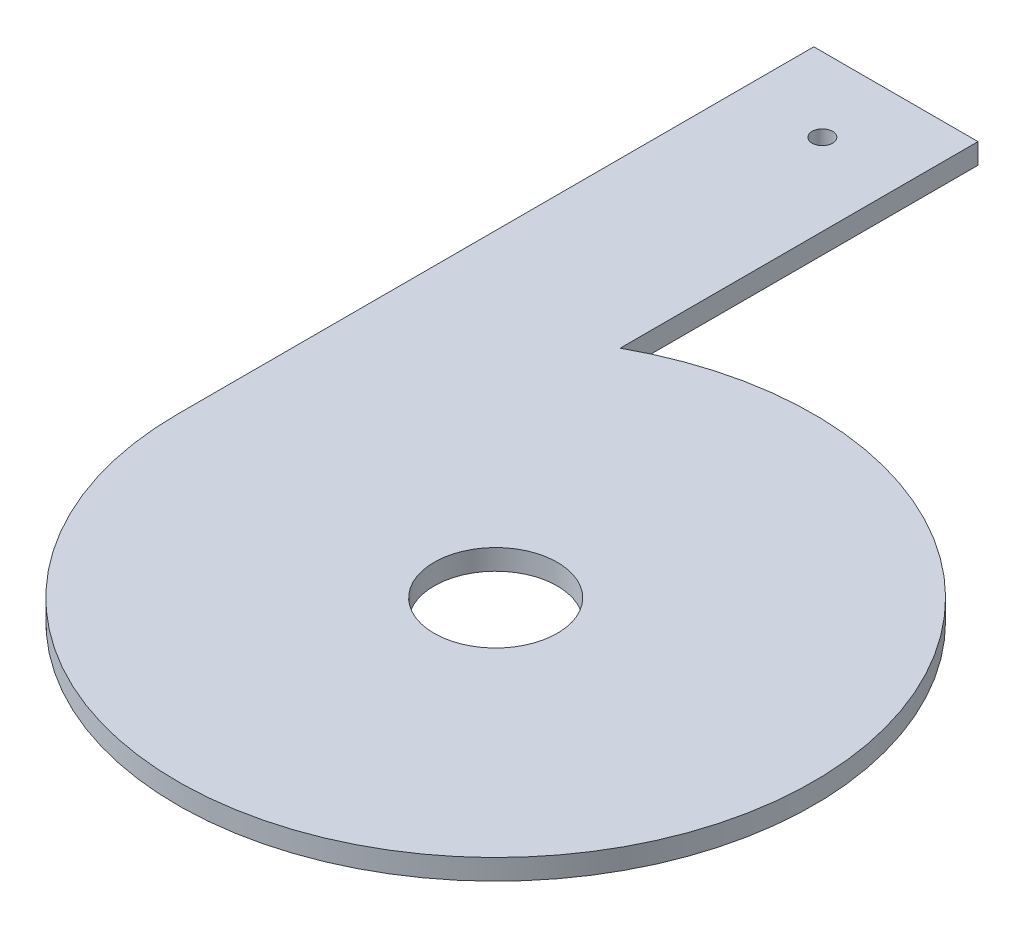
ISO-10303-21;
HEADER;
FILE_DESCRIPTION(('STEP AP214'),'2;1');
FILE_NAME('part.step','',(''),(''),'','','');
FILE_SCHEMA(('AUTOMOTIVE_DESIGN { 1 0 10303 214 1 1 1 1 }'));
ENDSEC;
DATA;
#1=APPLICATION_CONTEXT('core data for automotive mechanical design processes');
#2=APPLICATION_PROTOCOL_DEFINITION('international standard','automotive_design',2000,#1);
#3=PRODUCT_CONTEXT('',#1,'mechanical');
#4=PRODUCT('Part','Part','',(#3));
#5=PRODUCT_RELATED_PRODUCT_CATEGORY('part','',(#4));
#6=PRODUCT_DEFINITION_FORMATION('','',#4);
#7=PRODUCT_DEFINITION_CONTEXT('part definition',#1,'design');
#8=PRODUCT_DEFINITION('design','',#6,#7);
#9=PRODUCT_DEFINITION_SHAPE('','',#8);
#10=(LENGTH_UNIT() NAMED_UNIT(*) SI_UNIT(.MILLI.,.METRE.));
#11=(NAMED_UNIT(*) PLANE_ANGLE_UNIT() SI_UNIT($,.RADIAN.));
#12=(NAMED_UNIT(*) SI_UNIT($,.STERADIAN.) SOLID_ANGLE_UNIT());
#13=UNCERTAINTY_MEASURE_WITH_UNIT(LENGTH_MEASURE(1.E-05),#10,'distance_accuracy_value','');
#14=(GEOMETRIC_REPRESENTATION_CONTEXT(3) GLOBAL_UNCERTAINTY_ASSIGNED_CONTEXT((#13)) GLOBAL_UNIT_ASSIGNED_CONTEXT((#10,
#11,#12)) REPRESENTATION_CONTEXT('',''));
#15=CARTESIAN_POINT('',(0.,0.,0.));
#16=DIRECTION('',(0.,0.,1.));
#17=DIRECTION('',(1.,0.,0.));
#18=AXIS2_PLACEMENT_3D('',#15,#16,#17);
#19=CARTESIAN_POINT('',(0.,2.,0.));
#20=DIRECTION('',(0.,-1.,0.));
#21=DIRECTION('',(0.,0.,-1.));
#22=AXIS2_PLACEMENT_3D('',#19,#20,#21);
#23=CYLINDRICAL_SURFACE('',#22,31.);
#24=CARTESIAN_POINT('',(0.,0.,0.));
#25=DIRECTION('',(0.,1.,0.));
#26=DIRECTION('',(0.,0.,1.));
#27=AXIS2_PLACEMENT_3D('',#24,#25,#26);
#28=CIRCLE('',#27,31.);
#29=CARTESIAN_POINT('',(-31.,0.,0.));
#30=VERTEX_POINT('',#29);
#31=CARTESIAN_POINT('',(-15.,0.,-27.1293199325011));
#32=VERTEX_POINT('',#31);
#33=EDGE_CURVE('E43',#30,#32,#28,.T.);
#34=ORIENTED_EDGE('',*,*,#33,.T.);
#35=DIRECTION('',(0.,-1.,0.));
#36=VECTOR('',#35,1.);
#37=CARTESIAN_POINT('',(-15.,2.,-27.1293199325011));
#38=LINE('',#37,#36);
#39=CARTESIAN_POINT('',(-15.,2.,-27.1293199325011));
#40=VERTEX_POINT('',#39);
#41=EDGE_CURVE('E61',#32,#40,#38,.F.);
#42=ORIENTED_EDGE('',*,*,#41,.T.);
#43=CARTESIAN_POINT('',(0.,2.,0.));
#44=DIRECTION('',(0.,1.,0.));
#45=DIRECTION('',(0.,0.,1.));
#46=AXIS2_PLACEMENT_3D('',#43,#44,#45);
#47=CIRCLE('',#46,31.);
#48=CARTESIAN_POINT('',(-31.,2.,0.));
#49=VERTEX_POINT('',#48);
#50=EDGE_CURVE('E11',#49,#40,#47,.T.);
#51=ORIENTED_EDGE('',*,*,#50,.F.);
#52=DIRECTION('',(0.,1.,0.));
#53=VECTOR('',#52,1.);
#54=CARTESIAN_POINT('',(-31.,0.,0.));
#55=LINE('',#54,#53);
#56=EDGE_CURVE('E83',#30,#49,#55,.T.);
#57=ORIENTED_EDGE('',*,*,#56,.F.);
#58=EDGE_LOOP('',(#34,#42,#51,#57));
#59=FACE_BOUND('',#58,.T.);
#60=ADVANCED_FACE('F40',(#59),#23,.T.);
#61=CARTESIAN_POINT('',(0.,2.,0.));
#62=DIRECTION('',(0.,1.,0.));
#63=DIRECTION('',(0.,0.,1.));
#64=AXIS2_PLACEMENT_3D('',#61,#62,#63);
#65=PLANE('',#64);
#66=CARTESIAN_POINT('',(-22.9499999999912,2.,-54.7799999999946));
#67=DIRECTION('',(0.,1.,0.));
#68=DIRECTION('',(0.,0.,1.));
#69=AXIS2_PLACEMENT_3D('',#66,#67,#68);
#70=CIRCLE('',#69,1.);
#71=CARTESIAN_POINT('',(-22.9499999999912,2.,-53.7799999999946));
#72=VERTEX_POINT('',#71);
#73=EDGE_CURVE('E121',#72,#72,#70,.T.);
#74=ORIENTED_EDGE('',*,*,#73,.F.);
#75=EDGE_LOOP('',(#74));
#76=FACE_BOUND('',#75,.T.);
#77=ORIENTED_EDGE('',*,*,#50,.T.);
#78=DIRECTION('',(0.,0.,-1.));
#79=VECTOR('',#78,1.);
#80=CARTESIAN_POINT('',(-15.,2.,0.));
#81=LINE('',#80,#79);
#82=CARTESIAN_POINT('',(-15.,2.,-62.));
#83=VERTEX_POINT('',#82);
#84=EDGE_CURVE('E113',#40,#83,#81,.T.);
#85=ORIENTED_EDGE('',*,*,#84,.T.);
#86=DIRECTION('',(-1.,0.,0.));
#87=VECTOR('',#86,1.);
#88=CARTESIAN_POINT('',(-31.,2.,-62.));
#89=LINE('',#88,#87);
#90=CARTESIAN_POINT('',(-31.,2.,-62.));
#91=VERTEX_POINT('',#90);
#92=EDGE_CURVE('E91',#83,#91,#89,.T.);
#93=ORIENTED_EDGE('',*,*,#92,.T.);
#94=DIRECTION('',(0.,0.,1.));
#95=VECTOR('',#94,1.);
#96=CARTESIAN_POINT('',(-31.,2.,0.));
#97=LINE('',#96,#95);
#98=EDGE_CURVE('E53',#91,#49,#97,.T.);
#99=ORIENTED_EDGE('',*,*,#98,.T.);
#100=EDGE_LOOP('',(#77,#85,#93,#99));
#101=FACE_BOUND('',#100,.T.);
#102=CARTESIAN_POINT('',(0.,2.,0.));
#103=DIRECTION('',(0.,1.,0.));
#104=DIRECTION('',(0.,0.,1.));
#105=AXIS2_PLACEMENT_3D('',#102,#103,#104);
#106=CIRCLE('',#105,6.);
#107=CARTESIAN_POINT('',(0.,2.,6.));
#108=VERTEX_POINT('',#107);
#109=EDGE_CURVE('E102',#108,#108,#106,.T.);
#110=ORIENTED_EDGE('',*,*,#109,.F.);
#111=EDGE_LOOP('',(#110));
#112=FACE_BOUND('',#111,.T.);
#113=ADVANCED_FACE('F128',(#76,#101,#112),#65,.T.);
#114=CARTESIAN_POINT('',(0.,0.,0.));
#115=DIRECTION('',(0.,1.,0.));
#116=DIRECTION('',(0.,0.,1.));
#117=AXIS2_PLACEMENT_3D('',#114,#115,#116);
#118=PLANE('',#117);
#119=CARTESIAN_POINT('',(-22.9499999999912,0.,-54.7799999999946));
#120=DIRECTION('',(0.,1.,0.));
#121=DIRECTION('',(0.,0.,1.));
#122=AXIS2_PLACEMENT_3D('',#119,#120,#121);
#123=CIRCLE('',#122,1.);
#124=CARTESIAN_POINT('',(-22.9499999999912,0.,-53.7799999999946));
#125=VERTEX_POINT('',#124);
#126=EDGE_CURVE('E116',#125,#125,#123,.F.);
#127=ORIENTED_EDGE('',*,*,#126,.F.);
#128=EDGE_LOOP('',(#127));
#129=FACE_BOUND('',#128,.T.);
#130=ORIENTED_EDGE('',*,*,#33,.F.);
#131=DIRECTION('',(0.,0.,1.));
#132=VECTOR('',#131,1.);
#133=CARTESIAN_POINT('',(-31.,0.,0.));
#134=LINE('',#133,#132);
#135=CARTESIAN_POINT('',(-31.,0.,-62.));
#136=VERTEX_POINT('',#135);
#137=EDGE_CURVE('E80',#136,#30,#134,.T.);
#138=ORIENTED_EDGE('',*,*,#137,.F.);
#139=DIRECTION('',(-1.,0.,0.));
#140=VECTOR('',#139,1.);
#141=CARTESIAN_POINT('',(-31.,0.,-62.));
#142=LINE('',#141,#140);
#143=CARTESIAN_POINT('',(-15.,0.,-62.));
#144=VERTEX_POINT('',#143);
#145=EDGE_CURVE('E96',#144,#136,#142,.T.);
#146=ORIENTED_EDGE('',*,*,#145,.F.);
#147=DIRECTION('',(0.,0.,-1.));
#148=VECTOR('',#147,1.);
#149=CARTESIAN_POINT('',(-15.,0.,0.));
#150=LINE('',#149,#148);
#151=EDGE_CURVE('E90',#32,#144,#150,.T.);
#152=ORIENTED_EDGE('',*,*,#151,.F.);
#153=EDGE_LOOP('',(#130,#138,#146,#152));
#154=FACE_BOUND('',#153,.T.);
#155=CARTESIAN_POINT('',(0.,0.,0.));
#156=DIRECTION('',(0.,1.,0.));
#157=DIRECTION('',(0.,0.,1.));
#158=AXIS2_PLACEMENT_3D('',#155,#156,#157);
#159=CIRCLE('',#158,6.);
#160=CARTESIAN_POINT('',(0.,0.,6.));
#161=VERTEX_POINT('',#160);
#162=EDGE_CURVE('E100',#161,#161,#159,.T.);
#163=ORIENTED_EDGE('',*,*,#162,.T.);
#164=EDGE_LOOP('',(#163));
#165=FACE_BOUND('',#164,.T.);
#166=ADVANCED_FACE('F98',(#129,#154,#165),#118,.F.);
#167=CARTESIAN_POINT('',(0.,0.,0.));
#168=DIRECTION('',(0.,1.,0.));
#169=DIRECTION('',(0.,0.,1.));
#170=AXIS2_PLACEMENT_3D('',#167,#168,#169);
#171=CYLINDRICAL_SURFACE('',#170,6.);
#172=ORIENTED_EDGE('',*,*,#162,.F.);
#173=EDGE_LOOP('',(#172));
#174=FACE_BOUND('',#173,.T.);
#175=ORIENTED_EDGE('',*,*,#109,.T.);
#176=EDGE_LOOP('',(#175));
#177=FACE_BOUND('',#176,.T.);
#178=ADVANCED_FACE('F134',(#174,#177),#171,.F.);
#179=CARTESIAN_POINT('',(-15.,0.,0.));
#180=DIRECTION('',(1.,0.,0.));
#181=DIRECTION('',(0.,0.,-1.));
#182=AXIS2_PLACEMENT_3D('',#179,#180,#181);
#183=PLANE('',#182);
#184=ORIENTED_EDGE('',*,*,#41,.F.);
#185=ORIENTED_EDGE('',*,*,#151,.T.);
#186=DIRECTION('',(0.,1.,0.));
#187=VECTOR('',#186,1.);
#188=CARTESIAN_POINT('',(-15.,0.,-62.));
#189=LINE('',#188,#187);
#190=EDGE_CURVE('E95',#144,#83,#189,.T.);
#191=ORIENTED_EDGE('',*,*,#190,.T.);
#192=ORIENTED_EDGE('',*,*,#84,.F.);
#193=EDGE_LOOP('',(#184,#185,#191,#192));
#194=FACE_BOUND('',#193,.T.);
#195=ADVANCED_FACE('F136',(#194),#183,.T.);
#196=CARTESIAN_POINT('',(-31.,0.,0.));
#197=DIRECTION('',(-1.,0.,0.));
#198=DIRECTION('',(0.,0.,1.));
#199=AXIS2_PLACEMENT_3D('',#196,#197,#198);
#200=PLANE('',#199);
#201=ORIENTED_EDGE('',*,*,#98,.F.);
#202=DIRECTION('',(0.,1.,0.));
#203=VECTOR('',#202,1.);
#204=CARTESIAN_POINT('',(-31.,0.,-62.));
#205=LINE('',#204,#203);
#206=EDGE_CURVE('E85',#136,#91,#205,.T.);
#207=ORIENTED_EDGE('',*,*,#206,.F.);
#208=ORIENTED_EDGE('',*,*,#137,.T.);
#209=ORIENTED_EDGE('',*,*,#56,.T.);
#210=EDGE_LOOP('',(#201,#207,#208,#209));
#211=FACE_BOUND('',#210,.T.);
#212=ADVANCED_FACE('F82',(#211),#200,.T.);
#213=CARTESIAN_POINT('',(-31.,0.,-62.));
#214=DIRECTION('',(0.,0.,-1.));
#215=DIRECTION('',(-1.,0.,0.));
#216=AXIS2_PLACEMENT_3D('',#213,#214,#215);
#217=PLANE('',#216);
#218=ORIENTED_EDGE('',*,*,#92,.F.);
#219=ORIENTED_EDGE('',*,*,#190,.F.);
#220=ORIENTED_EDGE('',*,*,#145,.T.);
#221=ORIENTED_EDGE('',*,*,#206,.T.);
#222=EDGE_LOOP('',(#218,#219,#220,#221));
#223=FACE_BOUND('',#222,.T.);
#224=ADVANCED_FACE('F163',(#223),#217,.T.);
#225=CARTESIAN_POINT('',(-22.9499999999912,-0.00100000000000013,-54.7799999999946));
#226=DIRECTION('',(0.,1.,0.));
#227=DIRECTION('',(0.,0.,1.));
#228=AXIS2_PLACEMENT_3D('',#225,#226,#227);
#229=CYLINDRICAL_SURFACE('',#228,1.);
#230=ORIENTED_EDGE('',*,*,#73,.T.);
#231=EDGE_LOOP('',(#230));
#232=FACE_BOUND('',#231,.T.);
#233=ORIENTED_EDGE('',*,*,#126,.T.);
#234=EDGE_LOOP('',(#233));
#235=FACE_BOUND('',#234,.T.);
#236=ADVANCED_FACE('F125',(#232,#235),#229,.F.);
#237=CLOSED_SHELL('',(#60,#113,#166,#178,#195,#212,#224,#236));
#238=MANIFOLD_SOLID_BREP('B2',#237);
#239=ADVANCED_BREP_SHAPE_REPRESENTATION('',(#18,#238),#14);
#240=SHAPE_DEFINITION_REPRESENTATION(#9,#239);
ENDSEC;
END-ISO-10303-21;
